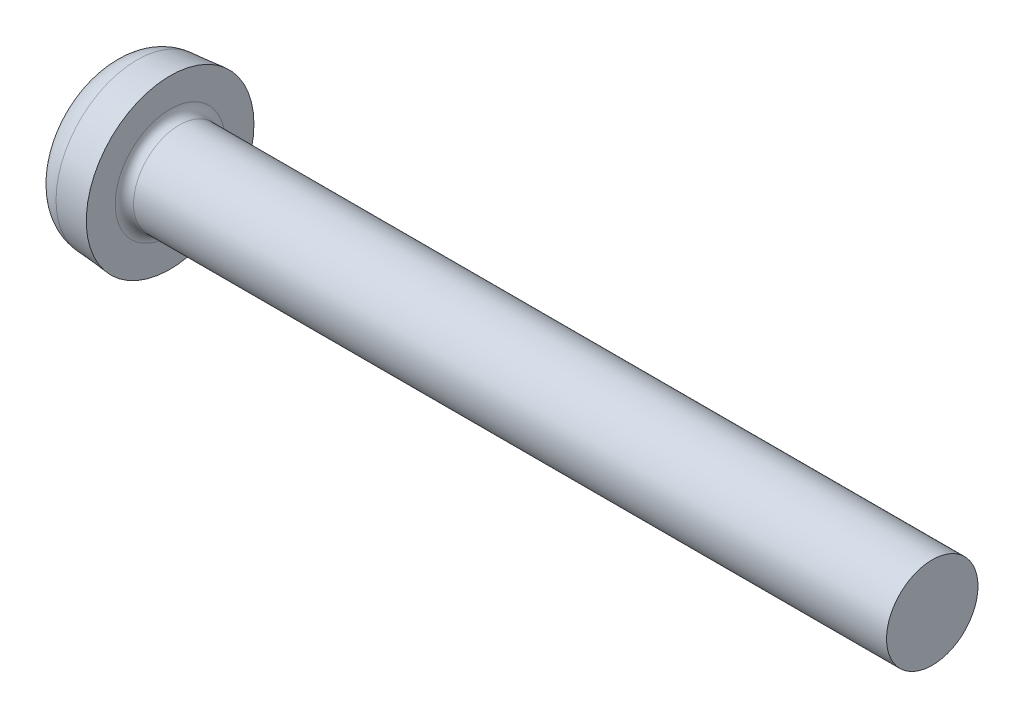
ISO-10303-21;
HEADER;
FILE_DESCRIPTION(('STEP AP214'),'2;1');
FILE_NAME('part.step','',(''),(''),'','','');
FILE_SCHEMA(('AUTOMOTIVE_DESIGN { 1 0 10303 214 1 1 1 1 }'));
ENDSEC;
DATA;
#1=APPLICATION_CONTEXT('core data for automotive mechanical design processes');
#2=APPLICATION_PROTOCOL_DEFINITION('international standard','automotive_design',2000,#1);
#3=PRODUCT_CONTEXT('',#1,'mechanical');
#4=PRODUCT('Part','Part','',(#3));
#5=PRODUCT_RELATED_PRODUCT_CATEGORY('part','',(#4));
#6=PRODUCT_DEFINITION_FORMATION('','',#4);
#7=PRODUCT_DEFINITION_CONTEXT('part definition',#1,'design');
#8=PRODUCT_DEFINITION('design','',#6,#7);
#9=PRODUCT_DEFINITION_SHAPE('','',#8);
#10=(LENGTH_UNIT() NAMED_UNIT(*) SI_UNIT(.MILLI.,.METRE.));
#11=(NAMED_UNIT(*) PLANE_ANGLE_UNIT() SI_UNIT($,.RADIAN.));
#12=(NAMED_UNIT(*) SI_UNIT($,.STERADIAN.) SOLID_ANGLE_UNIT());
#13=UNCERTAINTY_MEASURE_WITH_UNIT(LENGTH_MEASURE(1.E-05),#10,'distance_accuracy_value','');
#14=(GEOMETRIC_REPRESENTATION_CONTEXT(3) GLOBAL_UNCERTAINTY_ASSIGNED_CONTEXT((#13)) GLOBAL_UNIT_ASSIGNED_CONTEXT((#10,
#11,#12)) REPRESENTATION_CONTEXT('',''));
#15=CARTESIAN_POINT('',(0.,0.,0.));
#16=DIRECTION('',(0.,0.,1.));
#17=DIRECTION('',(1.,0.,0.));
#18=AXIS2_PLACEMENT_3D('',#15,#16,#17);
#19=CARTESIAN_POINT('',(0.,0.,0.));
#20=DIRECTION('',(-1.,0.,0.));
#21=DIRECTION('',(0.,0.,1.));
#22=AXIS2_PLACEMENT_3D('',#19,#20,#21);
#23=PLANE('',#22);
#24=DIRECTION('',(0.,1.,0.));
#25=VECTOR('',#24,1.);
#26=CARTESIAN_POINT('',(0.,0.35,-0.35));
#27=LINE('',#26,#25);
#28=CARTESIAN_POINT('',(0.,0.65,-0.35));
#29=VERTEX_POINT('',#28);
#30=CARTESIAN_POINT('',(0.,1.62134434609834,-0.35));
#31=VERTEX_POINT('',#30);
#32=EDGE_CURVE('E344',#29,#31,#27,.T.);
#33=ORIENTED_EDGE('',*,*,#32,.T.);
#34=CARTESIAN_POINT('',(0.,0.,0.));
#35=DIRECTION('',(-1.,0.,0.));
#36=DIRECTION('',(0.,0.,1.));
#37=AXIS2_PLACEMENT_3D('',#34,#35,#36);
#38=CIRCLE('',#37,1.65869149893072);
#39=CARTESIAN_POINT('',(0.,0.35,-1.62134434609834));
#40=VERTEX_POINT('',#39);
#41=EDGE_CURVE('E309',#31,#40,#38,.T.);
#42=ORIENTED_EDGE('',*,*,#41,.T.);
#43=DIRECTION('',(0.,0.,1.));
#44=VECTOR('',#43,1.);
#45=CARTESIAN_POINT('',(0.,0.35,-0.35));
#46=LINE('',#45,#44);
#47=CARTESIAN_POINT('',(0.,0.35,-0.65));
#48=VERTEX_POINT('',#47);
#49=EDGE_CURVE('E322',#40,#48,#46,.T.);
#50=ORIENTED_EDGE('',*,*,#49,.T.);
#51=CARTESIAN_POINT('',(0.,0.65,-0.65));
#52=DIRECTION('',(-1.,0.,0.));
#53=DIRECTION('',(0.,0.,1.));
#54=AXIS2_PLACEMENT_3D('',#51,#52,#53);
#55=CIRCLE('',#54,0.3);
#56=EDGE_CURVE('E371',#48,#29,#55,.T.);
#57=ORIENTED_EDGE('',*,*,#56,.T.);
#58=EDGE_LOOP('',(#33,#42,#50,#57));
#59=FACE_BOUND('',#58,.T.);
#60=ADVANCED_FACE('F39',(#59),#23,.T.);
#61=DIRECTION('',(0.,0.,-1.));
#62=VECTOR('',#61,1.);
#63=CARTESIAN_POINT('',(0.,-0.35,-0.35));
#64=LINE('',#63,#62);
#65=CARTESIAN_POINT('',(0.,-0.35,-0.65));
#66=VERTEX_POINT('',#65);
#67=CARTESIAN_POINT('',(0.,-0.35,-1.62134434609834));
#68=VERTEX_POINT('',#67);
#69=EDGE_CURVE('E337',#66,#68,#64,.T.);
#70=ORIENTED_EDGE('',*,*,#69,.T.);
#71=CARTESIAN_POINT('',(0.,0.,0.));
#72=DIRECTION('',(-1.,0.,0.));
#73=DIRECTION('',(0.,0.,1.));
#74=AXIS2_PLACEMENT_3D('',#71,#72,#73);
#75=CIRCLE('',#74,1.65869149893072);
#76=CARTESIAN_POINT('',(0.,-1.62134434609834,-0.35));
#77=VERTEX_POINT('',#76);
#78=EDGE_CURVE('E301',#68,#77,#75,.T.);
#79=ORIENTED_EDGE('',*,*,#78,.T.);
#80=DIRECTION('',(0.,1.,0.));
#81=VECTOR('',#80,1.);
#82=CARTESIAN_POINT('',(0.,-0.35,-0.35));
#83=LINE('',#82,#81);
#84=CARTESIAN_POINT('',(0.,-0.65,-0.35));
#85=VERTEX_POINT('',#84);
#86=EDGE_CURVE('E114',#77,#85,#83,.T.);
#87=ORIENTED_EDGE('',*,*,#86,.T.);
#88=CARTESIAN_POINT('',(0.,-0.65,-0.65));
#89=DIRECTION('',(-1.,0.,0.));
#90=DIRECTION('',(0.,0.,1.));
#91=AXIS2_PLACEMENT_3D('',#88,#89,#90);
#92=CIRCLE('',#91,0.3);
#93=EDGE_CURVE('E342',#85,#66,#92,.T.);
#94=ORIENTED_EDGE('',*,*,#93,.T.);
#95=EDGE_LOOP('',(#70,#79,#87,#94));
#96=FACE_BOUND('',#95,.T.);
#97=ADVANCED_FACE('F252',(#96),#23,.T.);
#98=DIRECTION('',(0.,-1.,0.));
#99=VECTOR('',#98,1.);
#100=CARTESIAN_POINT('',(0.,-0.35,0.35));
#101=LINE('',#100,#99);
#102=CARTESIAN_POINT('',(0.,-0.65,0.35));
#103=VERTEX_POINT('',#102);
#104=CARTESIAN_POINT('',(0.,-1.62134434609834,0.349999999999999));
#105=VERTEX_POINT('',#104);
#106=EDGE_CURVE('E346',#103,#105,#101,.T.);
#107=ORIENTED_EDGE('',*,*,#106,.T.);
#108=CARTESIAN_POINT('',(0.,0.,0.));
#109=DIRECTION('',(-1.,0.,0.));
#110=DIRECTION('',(0.,0.,1.));
#111=AXIS2_PLACEMENT_3D('',#108,#109,#110);
#112=CIRCLE('',#111,1.65869149893072);
#113=CARTESIAN_POINT('',(0.,-0.35,1.62134434609834));
#114=VERTEX_POINT('',#113);
#115=EDGE_CURVE('E297',#105,#114,#112,.T.);
#116=ORIENTED_EDGE('',*,*,#115,.T.);
#117=DIRECTION('',(0.,0.,-1.));
#118=VECTOR('',#117,1.);
#119=CARTESIAN_POINT('',(0.,-0.35,0.35));
#120=LINE('',#119,#118);
#121=CARTESIAN_POINT('',(0.,-0.35,0.65));
#122=VERTEX_POINT('',#121);
#123=EDGE_CURVE('E292',#114,#122,#120,.T.);
#124=ORIENTED_EDGE('',*,*,#123,.T.);
#125=CARTESIAN_POINT('',(0.,-0.65,0.65));
#126=DIRECTION('',(-1.,0.,0.));
#127=DIRECTION('',(0.,0.,1.));
#128=AXIS2_PLACEMENT_3D('',#125,#126,#127);
#129=CIRCLE('',#128,0.3);
#130=EDGE_CURVE('E376',#122,#103,#129,.T.);
#131=ORIENTED_EDGE('',*,*,#130,.T.);
#132=EDGE_LOOP('',(#107,#116,#124,#131));
#133=FACE_BOUND('',#132,.T.);
#134=ADVANCED_FACE('F259',(#133),#23,.T.);
#135=DIRECTION('',(0.,0.,1.));
#136=VECTOR('',#135,1.);
#137=CARTESIAN_POINT('',(0.,0.35,0.35));
#138=LINE('',#137,#136);
#139=CARTESIAN_POINT('',(0.,0.35,0.65));
#140=VERTEX_POINT('',#139);
#141=CARTESIAN_POINT('',(0.,0.35,1.62134434609834));
#142=VERTEX_POINT('',#141);
#143=EDGE_CURVE('E278',#140,#142,#138,.T.);
#144=ORIENTED_EDGE('',*,*,#143,.T.);
#145=CARTESIAN_POINT('',(0.,0.,0.));
#146=DIRECTION('',(-1.,0.,0.));
#147=DIRECTION('',(0.,0.,1.));
#148=AXIS2_PLACEMENT_3D('',#145,#146,#147);
#149=CIRCLE('',#148,1.65869149893072);
#150=CARTESIAN_POINT('',(0.,1.62134434609834,0.35));
#151=VERTEX_POINT('',#150);
#152=EDGE_CURVE('E282',#142,#151,#149,.T.);
#153=ORIENTED_EDGE('',*,*,#152,.T.);
#154=DIRECTION('',(0.,-1.,0.));
#155=VECTOR('',#154,1.);
#156=CARTESIAN_POINT('',(0.,0.35,0.35));
#157=LINE('',#156,#155);
#158=CARTESIAN_POINT('',(0.,0.65,0.35));
#159=VERTEX_POINT('',#158);
#160=EDGE_CURVE('E351',#151,#159,#157,.T.);
#161=ORIENTED_EDGE('',*,*,#160,.T.);
#162=CARTESIAN_POINT('',(0.,0.65,0.65));
#163=DIRECTION('',(-1.,0.,0.));
#164=DIRECTION('',(0.,0.,1.));
#165=AXIS2_PLACEMENT_3D('',#162,#163,#164);
#166=CIRCLE('',#165,0.3);
#167=EDGE_CURVE('E286',#159,#140,#166,.T.);
#168=ORIENTED_EDGE('',*,*,#167,.T.);
#169=EDGE_LOOP('',(#144,#153,#161,#168));
#170=FACE_BOUND('',#169,.T.);
#171=ADVANCED_FACE('F255',(#170),#23,.T.);
#172=CARTESIAN_POINT('',(27.,1.5,0.));
#173=DIRECTION('',(1.,0.,0.));
#174=DIRECTION('',(0.,0.,-1.));
#175=AXIS2_PLACEMENT_3D('',#172,#173,#174);
#176=PLANE('',#175);
#177=CARTESIAN_POINT('',(27.,0.,0.));
#178=DIRECTION('',(1.,0.,0.));
#179=DIRECTION('',(0.,0.,-1.));
#180=AXIS2_PLACEMENT_3D('',#177,#178,#179);
#181=CIRCLE('',#180,1.5);
#182=CARTESIAN_POINT('',(27.,0.,-1.5));
#183=VERTEX_POINT('',#182);
#184=EDGE_CURVE('E365',#183,#183,#181,.T.);
#185=ORIENTED_EDGE('',*,*,#184,.T.);
#186=EDGE_LOOP('',(#185));
#187=FACE_BOUND('',#186,.T.);
#188=ADVANCED_FACE('F264',(#187),#176,.T.);
#189=CARTESIAN_POINT('',(4.51581291088132,0.,0.));
#190=DIRECTION('',(1.,0.,0.));
#191=DIRECTION('',(0.,0.,-1.));
#192=AXIS2_PLACEMENT_3D('',#189,#190,#191);
#193=CYLINDRICAL_SURFACE('',#192,1.5);
#194=CARTESIAN_POINT('',(2.3,0.,0.));
#195=DIRECTION('',(1.,0.,0.));
#196=DIRECTION('',(0.,0.,-1.));
#197=AXIS2_PLACEMENT_3D('',#194,#195,#196);
#198=CIRCLE('',#197,1.5);
#199=CARTESIAN_POINT('',(2.3,0.,-1.5));
#200=VERTEX_POINT('',#199);
#201=EDGE_CURVE('E362',#200,#200,#198,.T.);
#202=ORIENTED_EDGE('',*,*,#201,.T.);
#203=EDGE_LOOP('',(#202));
#204=FACE_BOUND('',#203,.T.);
#205=ORIENTED_EDGE('',*,*,#184,.F.);
#206=EDGE_LOOP('',(#205));
#207=FACE_BOUND('',#206,.T.);
#208=ADVANCED_FACE('F270',(#204,#207),#193,.T.);
#209=CARTESIAN_POINT('',(2.3,0.,0.));
#210=DIRECTION('',(1.,0.,0.));
#211=DIRECTION('',(0.,0.,-1.));
#212=AXIS2_PLACEMENT_3D('',#209,#210,#211);
#213=TOROIDAL_SURFACE('',#212,1.8,0.3);
#214=CARTESIAN_POINT('',(2.,0.,0.));
#215=DIRECTION('',(1.,0.,0.));
#216=DIRECTION('',(0.,0.,-1.));
#217=AXIS2_PLACEMENT_3D('',#214,#215,#216);
#218=CIRCLE('',#217,1.8);
#219=CARTESIAN_POINT('',(2.,0.,-1.8));
#220=VERTEX_POINT('',#219);
#221=EDGE_CURVE('E358',#220,#220,#218,.T.);
#222=ORIENTED_EDGE('',*,*,#221,.T.);
#223=EDGE_LOOP('',(#222));
#224=FACE_BOUND('',#223,.T.);
#225=ORIENTED_EDGE('',*,*,#201,.F.);
#226=EDGE_LOOP('',(#225));
#227=FACE_BOUND('',#226,.T.);
#228=ADVANCED_FACE('F530',(#224,#227),#213,.F.);
#229=CARTESIAN_POINT('',(2.,1.8,0.));
#230=DIRECTION('',(1.,0.,0.));
#231=DIRECTION('',(0.,0.,-1.));
#232=AXIS2_PLACEMENT_3D('',#229,#230,#231);
#233=PLANE('',#232);
#234=CARTESIAN_POINT('',(2.,0.,0.));
#235=DIRECTION('',(1.,0.,0.));
#236=DIRECTION('',(0.,0.,-1.));
#237=AXIS2_PLACEMENT_3D('',#234,#235,#236);
#238=CIRCLE('',#237,2.75);
#239=CARTESIAN_POINT('',(2.,0.,-2.75));
#240=VERTEX_POINT('',#239);
#241=EDGE_CURVE('E354',#240,#240,#238,.T.);
#242=ORIENTED_EDGE('',*,*,#241,.T.);
#243=EDGE_LOOP('',(#242));
#244=FACE_BOUND('',#243,.T.);
#245=ORIENTED_EDGE('',*,*,#221,.F.);
#246=EDGE_LOOP('',(#245));
#247=FACE_BOUND('',#246,.T.);
#248=ADVANCED_FACE('F534',(#244,#247),#233,.T.);
#249=CARTESIAN_POINT('',(2.,0.,0.));
#250=DIRECTION('',(1.,0.,0.));
#251=DIRECTION('',(0.,0.,-1.));
#252=AXIS2_PLACEMENT_3D('',#249,#250,#251);
#253=CONICAL_SURFACE('',#252,2.75,0.0872664625997202);
#254=CARTESIAN_POINT('',(0.91284425725234,0.,0.));
#255=DIRECTION('',(-1.,0.,0.));
#256=DIRECTION('',(0.,0.,1.));
#257=AXIS2_PLACEMENT_3D('',#254,#255,#256);
#258=CIRCLE('',#257,2.65488619702247);
#259=CARTESIAN_POINT('',(0.91284425725234,0.,2.65488619702247));
#260=VERTEX_POINT('',#259);
#261=EDGE_CURVE('E298',#260,#260,#258,.F.);
#262=ORIENTED_EDGE('',*,*,#261,.T.);
#263=EDGE_LOOP('',(#262));
#264=FACE_BOUND('',#263,.T.);
#265=ORIENTED_EDGE('',*,*,#241,.F.);
#266=EDGE_LOOP('',(#265));
#267=FACE_BOUND('',#266,.T.);
#268=ADVANCED_FACE('F537',(#264,#267),#253,.T.);
#269=CARTESIAN_POINT('',(2.,0.35,0.35));
#270=DIRECTION('',(0.,-1.,0.));
#271=DIRECTION('',(0.,0.,-1.));
#272=AXIS2_PLACEMENT_3D('',#269,#270,#271);
#273=PLANE('',#272);
#274=DIRECTION('',(-0.939692620785908,0.,0.342020143325669));
#275=VECTOR('',#274,1.);
#276=CARTESIAN_POINT('',(0.,0.35,1.75));
#277=LINE('',#276,#275);
#278=CARTESIAN_POINT('',(2.,0.35,1.02205953146759));
#279=VERTEX_POINT('',#278);
#280=CARTESIAN_POINT('',(0.00762366491673901,0.35,1.74722521289429));
#281=VERTEX_POINT('',#280);
#282=EDGE_CURVE('E359',#279,#281,#277,.T.);
#283=ORIENTED_EDGE('',*,*,#282,.T.);
#284=CARTESIAN_POINT('',(0.00796535573110795,0.35,1.75));
#285=CARTESIAN_POINT('',(0.00530925160597725,0.35,1.72863961284289));
#286=CARTESIAN_POINT('',(0.00331741989986699,0.35,1.70723809914295));
#287=CARTESIAN_POINT('',(0.000662305181537883,0.35,1.66435288093683));
#288=CARTESIAN_POINT('',(-9.81689388392556E-07,0.35,1.64286917666955));
#289=CARTESIAN_POINT('',(0.,0.35,1.62134434609834));
#290=B_SPLINE_CURVE_WITH_KNOTS('',3,(#284,#285,#286,#287,#288,#289),.UNSPECIFIED.,.F.,.F.,(4,2,
4),(0.,0.0644820102024402,0.128963833119088),.UNSPECIFIED.);
#291=EDGE_CURVE('E189',#281,#142,#290,.T.);
#292=ORIENTED_EDGE('',*,*,#291,.T.);
#293=ORIENTED_EDGE('',*,*,#143,.F.);
#294=DIRECTION('',(-1.,0.,0.));
#295=VECTOR('',#294,1.);
#296=CARTESIAN_POINT('',(2.,0.35,0.65));
#297=LINE('',#296,#295);
#298=CARTESIAN_POINT('',(2.,0.35,0.65));
#299=VERTEX_POINT('',#298);
#300=EDGE_CURVE('E389',#140,#299,#297,.F.);
#301=ORIENTED_EDGE('',*,*,#300,.T.);
#302=DIRECTION('',(0.,0.,1.));
#303=VECTOR('',#302,1.);
#304=CARTESIAN_POINT('',(2.,0.35,0.35));
#305=LINE('',#304,#303);
#306=EDGE_CURVE('E353',#299,#279,#305,.T.);
#307=ORIENTED_EDGE('',*,*,#306,.T.);
#308=EDGE_LOOP('',(#283,#292,#293,#301,#307));
#309=FACE_BOUND('',#308,.T.);
#310=ADVANCED_FACE('F444',(#309),#273,.T.);
#311=CARTESIAN_POINT('',(0.,0.,1.75));
#312=DIRECTION('',(-0.342020143325669,0.,-0.939692620785908));
#313=DIRECTION('',(-0.939692620785908,0.,0.342020143325669));
#314=AXIS2_PLACEMENT_3D('',#311,#312,#313);
#315=PLANE('',#314);
#316=DIRECTION('',(-0.939692620785908,0.,0.342020143325669));
#317=VECTOR('',#316,1.);
#318=CARTESIAN_POINT('',(2.21599576989956,-0.35,0.943443500496743));
#319=LINE('',#318,#317);
#320=CARTESIAN_POINT('',(2.,-0.35,1.02205953146759));
#321=VERTEX_POINT('',#320);
#322=CARTESIAN_POINT('',(0.00762366491673973,-0.35,1.74722521289429));
#323=VERTEX_POINT('',#322);
#324=EDGE_CURVE('E440',#321,#323,#319,.T.);
#325=ORIENTED_EDGE('',*,*,#324,.T.);
#326=CARTESIAN_POINT('',(0.00762366491673973,-0.35,1.74722521289429));
#327=CARTESIAN_POINT('',(0.00630099140167022,-0.291673398723648,1.74770662668342));
#328=CARTESIAN_POINT('',(0.00540592205497321,-0.233339136124059,1.74803240528323));
#329=CARTESIAN_POINT('',(0.00427721541103727,-0.11666991507326,1.74844322090484));
#330=CARTESIAN_POINT('',(0.00404349915785195,-0.0583349575366301,1.74852828666426));
#331=CARTESIAN_POINT('',(0.00404349915785195,0.0583349575366294,1.74852828666426));
#332=CARTESIAN_POINT('',(0.00427721541103727,0.116669915073259,1.74844322090484));
#333=CARTESIAN_POINT('',(0.00540592205497322,0.233339136124058,1.74803240528323));
#334=CARTESIAN_POINT('',(0.00630099140167022,0.291673398723647,1.74770662668342));
#335=CARTESIAN_POINT('',(0.00762366491673974,0.35,1.74722521289429));
#336=B_SPLINE_CURVE_WITH_KNOTS('',3,(#326,#327,#328,#329,#330,#331,#332,#333,#334,#335),
.UNSPECIFIED.,.F.,.F.,(4,2,2,2,4),(0.,0.17502399992484,0.350027103646371,0.525030207367903,
0.700054207292742),.UNSPECIFIED.);
#337=EDGE_CURVE('E137',#323,#281,#336,.T.);
#338=ORIENTED_EDGE('',*,*,#337,.T.);
#339=ORIENTED_EDGE('',*,*,#282,.F.);
#340=DIRECTION('',(0.,-1.,0.));
#341=VECTOR('',#340,1.);
#342=CARTESIAN_POINT('',(2.,0.,1.02205953146759));
#343=LINE('',#342,#341);
#344=EDGE_CURVE('E447',#279,#321,#343,.T.);
#345=ORIENTED_EDGE('',*,*,#344,.T.);
#346=EDGE_LOOP('',(#325,#338,#339,#345));
#347=FACE_BOUND('',#346,.T.);
#348=ADVANCED_FACE('F167',(#347),#315,.T.);
#349=CARTESIAN_POINT('',(2.,-0.35,0.35));
#350=DIRECTION('',(0.,1.,0.));
#351=DIRECTION('',(0.,0.,1.));
#352=AXIS2_PLACEMENT_3D('',#349,#350,#351);
#353=PLANE('',#352);
#354=ORIENTED_EDGE('',*,*,#123,.F.);
#355=CARTESIAN_POINT('',(0.,-0.35,1.62134434609834));
#356=CARTESIAN_POINT('',(-9.81689387233393E-07,-0.35,1.64286917666955));
#357=CARTESIAN_POINT('',(0.000662305181538479,-0.35,1.66435288093683));
#358=CARTESIAN_POINT('',(0.00331741989986632,-0.35,1.70723809914295));
#359=CARTESIAN_POINT('',(0.00530925160597587,-0.35,1.72863961284289));
#360=CARTESIAN_POINT('',(0.00796535573110579,-0.35,1.75));
#361=B_SPLINE_CURVE_WITH_KNOTS('',3,(#355,#356,#357,#358,#359,#360),.UNSPECIFIED.,.F.,.F.,(4,2,
4),(0.,0.0644818229166476,0.128963833119088),.UNSPECIFIED.);
#362=EDGE_CURVE('E131',#114,#323,#361,.T.);
#363=ORIENTED_EDGE('',*,*,#362,.T.);
#364=ORIENTED_EDGE('',*,*,#324,.F.);
#365=DIRECTION('',(0.,0.,-1.));
#366=VECTOR('',#365,1.);
#367=CARTESIAN_POINT('',(2.,-0.35,0.35));
#368=LINE('',#367,#366);
#369=CARTESIAN_POINT('',(2.,-0.35,0.65));
#370=VERTEX_POINT('',#369);
#371=EDGE_CURVE('E448',#321,#370,#368,.T.);
#372=ORIENTED_EDGE('',*,*,#371,.T.);
#373=DIRECTION('',(-1.,0.,0.));
#374=VECTOR('',#373,1.);
#375=CARTESIAN_POINT('',(2.,-0.35,0.65));
#376=LINE('',#375,#374);
#377=EDGE_CURVE('E368',#370,#122,#376,.T.);
#378=ORIENTED_EDGE('',*,*,#377,.T.);
#379=EDGE_LOOP('',(#354,#363,#364,#372,#378));
#380=FACE_BOUND('',#379,.T.);
#381=ADVANCED_FACE('F474',(#380),#353,.T.);
#382=CARTESIAN_POINT('',(2.,-0.35,0.35));
#383=DIRECTION('',(0.,0.,-1.));
#384=DIRECTION('',(0.,1.,0.));
#385=AXIS2_PLACEMENT_3D('',#382,#383,#384);
#386=PLANE('',#385);
#387=DIRECTION('',(-0.939692620785908,-0.342020143325669,0.));
#388=VECTOR('',#387,1.);
#389=CARTESIAN_POINT('',(0.,-1.75,0.349999999999999));
#390=LINE('',#389,#388);
#391=CARTESIAN_POINT('',(2.,-1.02205953146759,0.349999999999999));
#392=VERTEX_POINT('',#391);
#393=CARTESIAN_POINT('',(0.00762366491673901,-1.74722521289429,0.349999999999999));
#394=VERTEX_POINT('',#393);
#395=EDGE_CURVE('E121',#392,#394,#390,.T.);
#396=ORIENTED_EDGE('',*,*,#395,.T.);
#397=CARTESIAN_POINT('',(0.00796535573110795,-1.75,0.349999999999999));
#398=CARTESIAN_POINT('',(0.00530925160597725,-1.72863961284289,0.349999999999999));
#399=CARTESIAN_POINT('',(0.003317419899867,-1.70723809914295,0.349999999999999));
#400=CARTESIAN_POINT('',(0.000662305181537898,-1.66435288093683,0.349999999999999));
#401=CARTESIAN_POINT('',(-9.81689388374026E-07,-1.64286917666955,0.349999999999999));
#402=CARTESIAN_POINT('',(0.,-1.62134434609834,0.349999999999999));
#403=B_SPLINE_CURVE_WITH_KNOTS('',3,(#397,#398,#399,#400,#401,#402),.UNSPECIFIED.,.F.,.F.,(4,2,
4),(0.,0.06448201020244,0.128963833119087),.UNSPECIFIED.);
#404=EDGE_CURVE('E130',#394,#105,#403,.T.);
#405=ORIENTED_EDGE('',*,*,#404,.T.);
#406=ORIENTED_EDGE('',*,*,#106,.F.);
#407=DIRECTION('',(-1.,0.,0.));
#408=VECTOR('',#407,1.);
#409=CARTESIAN_POINT('',(2.,-0.65,0.35));
#410=LINE('',#409,#408);
#411=CARTESIAN_POINT('',(2.,-0.65,0.35));
#412=VERTEX_POINT('',#411);
#413=EDGE_CURVE('E379',#103,#412,#410,.F.);
#414=ORIENTED_EDGE('',*,*,#413,.T.);
#415=DIRECTION('',(0.,-1.,0.));
#416=VECTOR('',#415,1.);
#417=CARTESIAN_POINT('',(2.,-0.35,0.35));
#418=LINE('',#417,#416);
#419=EDGE_CURVE('E450',#412,#392,#418,.T.);
#420=ORIENTED_EDGE('',*,*,#419,.T.);
#421=EDGE_LOOP('',(#396,#405,#406,#414,#420));
#422=FACE_BOUND('',#421,.T.);
#423=ADVANCED_FACE('F158',(#422),#386,.T.);
#424=CARTESIAN_POINT('',(0.,-1.75,0.));
#425=DIRECTION('',(-0.342020143325669,0.939692620785908,0.));
#426=DIRECTION('',(-0.939692620785908,-0.342020143325669,0.));
#427=AXIS2_PLACEMENT_3D('',#424,#425,#426);
#428=PLANE('',#427);
#429=DIRECTION('',(-0.939692620785908,-0.342020143325669,0.));
#430=VECTOR('',#429,1.);
#431=CARTESIAN_POINT('',(2.21599576989956,-0.943443500496743,-0.35));
#432=LINE('',#431,#430);
#433=CARTESIAN_POINT('',(2.,-1.02205953146759,-0.35));
#434=VERTEX_POINT('',#433);
#435=CARTESIAN_POINT('',(0.00762366491673973,-1.74722521289429,-0.35));
#436=VERTEX_POINT('',#435);
#437=EDGE_CURVE('E109',#434,#436,#432,.T.);
#438=ORIENTED_EDGE('',*,*,#437,.T.);
#439=CARTESIAN_POINT('',(0.00762366491673973,-1.74722521289429,-0.35));
#440=CARTESIAN_POINT('',(0.00630099140167022,-1.74770662668342,-0.291673398723648));
#441=CARTESIAN_POINT('',(0.00540592205497322,-1.74803240528323,-0.233339136124059));
#442=CARTESIAN_POINT('',(0.00427721541103729,-1.74844322090484,-0.11666991507326));
#443=CARTESIAN_POINT('',(0.00404349915785197,-1.74852828666426,-0.05833495753663));
#444=CARTESIAN_POINT('',(0.00404349915785198,-1.74852828666426,0.0583349575366293));
#445=CARTESIAN_POINT('',(0.0042772154110373,-1.74844322090484,0.116669915073259));
#446=CARTESIAN_POINT('',(0.00540592205497326,-1.74803240528323,0.233339136124058));
#447=CARTESIAN_POINT('',(0.00630099140167027,-1.74770662668342,0.291673398723647));
#448=CARTESIAN_POINT('',(0.00762366491673978,-1.74722521289429,0.349999999999999));
#449=B_SPLINE_CURVE_WITH_KNOTS('',3,(#439,#440,#441,#442,#443,#444,#445,#446,#447,#448),
.UNSPECIFIED.,.F.,.F.,(4,2,2,2,4),(0.,0.17502399992484,0.350027103646371,0.525030207367903,
0.700054207292742),.UNSPECIFIED.);
#450=EDGE_CURVE('E44',#436,#394,#449,.T.);
#451=ORIENTED_EDGE('',*,*,#450,.T.);
#452=ORIENTED_EDGE('',*,*,#395,.F.);
#453=DIRECTION('',(0.,0.,-1.));
#454=VECTOR('',#453,1.);
#455=CARTESIAN_POINT('',(2.,-1.02205953146759,0.));
#456=LINE('',#455,#454);
#457=EDGE_CURVE('E120',#392,#434,#456,.T.);
#458=ORIENTED_EDGE('',*,*,#457,.T.);
#459=EDGE_LOOP('',(#438,#451,#452,#458));
#460=FACE_BOUND('',#459,.T.);
#461=ADVANCED_FACE('F41',(#460),#428,.T.);
#462=CARTESIAN_POINT('',(2.,-0.35,-0.35));
#463=DIRECTION('',(0.,0.,1.));
#464=DIRECTION('',(1.,0.,0.));
#465=AXIS2_PLACEMENT_3D('',#462,#463,#464);
#466=PLANE('',#465);
#467=ORIENTED_EDGE('',*,*,#86,.F.);
#468=CARTESIAN_POINT('',(0.,-1.62134434609834,-0.35));
#469=CARTESIAN_POINT('',(-9.81689387233244E-07,-1.64286917666955,-0.35));
#470=CARTESIAN_POINT('',(0.000662305181538479,-1.66435288093683,-0.35));
#471=CARTESIAN_POINT('',(0.00331741989986632,-1.70723809914295,-0.35));
#472=CARTESIAN_POINT('',(0.00530925160597587,-1.72863961284289,-0.35));
#473=CARTESIAN_POINT('',(0.00796535573110579,-1.75,-0.35));
#474=B_SPLINE_CURVE_WITH_KNOTS('',3,(#468,#469,#470,#471,#472,#473),.UNSPECIFIED.,.F.,.F.,(4,2,
4),(0.,0.0644818229166476,0.128963833119088),.UNSPECIFIED.);
#475=EDGE_CURVE('E106',#77,#436,#474,.T.);
#476=ORIENTED_EDGE('',*,*,#475,.T.);
#477=ORIENTED_EDGE('',*,*,#437,.F.);
#478=DIRECTION('',(0.,1.,0.));
#479=VECTOR('',#478,1.);
#480=CARTESIAN_POINT('',(2.,-0.35,-0.35));
#481=LINE('',#480,#479);
#482=CARTESIAN_POINT('',(2.,-0.65,-0.35));
#483=VERTEX_POINT('',#482);
#484=EDGE_CURVE('E455',#434,#483,#481,.T.);
#485=ORIENTED_EDGE('',*,*,#484,.T.);
#486=DIRECTION('',(-1.,0.,0.));
#487=VECTOR('',#486,1.);
#488=CARTESIAN_POINT('',(2.,-0.65,-0.35));
#489=LINE('',#488,#487);
#490=EDGE_CURVE('E382',#483,#85,#489,.T.);
#491=ORIENTED_EDGE('',*,*,#490,.T.);
#492=EDGE_LOOP('',(#467,#476,#477,#485,#491));
#493=FACE_BOUND('',#492,.T.);
#494=ADVANCED_FACE('F107',(#493),#466,.T.);
#495=CARTESIAN_POINT('',(2.,-0.35,-0.35));
#496=DIRECTION('',(0.,1.,0.));
#497=DIRECTION('',(0.,0.,1.));
#498=AXIS2_PLACEMENT_3D('',#495,#496,#497);
#499=PLANE('',#498);
#500=DIRECTION('',(-0.939692620785908,0.,-0.342020143325669));
#501=VECTOR('',#500,1.);
#502=CARTESIAN_POINT('',(0.,-0.35,-1.75));
#503=LINE('',#502,#501);
#504=CARTESIAN_POINT('',(2.,-0.35,-1.02205953146759));
#505=VERTEX_POINT('',#504);
#506=CARTESIAN_POINT('',(0.0076236649167392,-0.35,-1.74722521289429));
#507=VERTEX_POINT('',#506);
#508=EDGE_CURVE('E122',#505,#507,#503,.T.);
#509=ORIENTED_EDGE('',*,*,#508,.T.);
#510=CARTESIAN_POINT('',(0.00796535573110795,-0.35,-1.75));
#511=CARTESIAN_POINT('',(0.00530925160597727,-0.35,-1.72863961284289));
#512=CARTESIAN_POINT('',(0.00331741989986703,-0.35,-1.70723809914295));
#513=CARTESIAN_POINT('',(0.000662305181537945,-0.35,-1.66435288093683));
#514=CARTESIAN_POINT('',(-9.81689388313481E-07,-0.35,-1.64286917666955));
#515=CARTESIAN_POINT('',(0.,-0.35,-1.62134434609834));
#516=B_SPLINE_CURVE_WITH_KNOTS('',3,(#510,#511,#512,#513,#514,#515),.UNSPECIFIED.,.F.,.F.,(4,2,
4),(0.,0.0644820102024402,0.128963833119088),.UNSPECIFIED.);
#517=EDGE_CURVE('E117',#507,#68,#516,.T.);
#518=ORIENTED_EDGE('',*,*,#517,.T.);
#519=ORIENTED_EDGE('',*,*,#69,.F.);
#520=DIRECTION('',(-1.,0.,0.));
#521=VECTOR('',#520,1.);
#522=CARTESIAN_POINT('',(2.,-0.35,-0.65));
#523=LINE('',#522,#521);
#524=CARTESIAN_POINT('',(2.,-0.35,-0.65));
#525=VERTEX_POINT('',#524);
#526=EDGE_CURVE('E384',#66,#525,#523,.F.);
#527=ORIENTED_EDGE('',*,*,#526,.T.);
#528=DIRECTION('',(0.,0.,-1.));
#529=VECTOR('',#528,1.);
#530=CARTESIAN_POINT('',(2.,-0.35,-0.35));
#531=LINE('',#530,#529);
#532=EDGE_CURVE('E457',#525,#505,#531,.T.);
#533=ORIENTED_EDGE('',*,*,#532,.T.);
#534=EDGE_LOOP('',(#509,#518,#519,#527,#533));
#535=FACE_BOUND('',#534,.T.);
#536=ADVANCED_FACE('F237',(#535),#499,.T.);
#537=CARTESIAN_POINT('',(0.,0.,-1.75));
#538=DIRECTION('',(-0.342020143325669,0.,0.939692620785908));
#539=DIRECTION('',(0.939692620785908,0.,0.342020143325669));
#540=AXIS2_PLACEMENT_3D('',#537,#538,#539);
#541=PLANE('',#540);
#542=DIRECTION('',(-0.939692620785908,0.,-0.342020143325669));
#543=VECTOR('',#542,1.);
#544=CARTESIAN_POINT('',(2.21599576989956,0.35,-0.943443500496744));
#545=LINE('',#544,#543);
#546=CARTESIAN_POINT('',(2.,0.35,-1.02205953146759));
#547=VERTEX_POINT('',#546);
#548=CARTESIAN_POINT('',(0.00762366491673973,0.35,-1.74722521289429));
#549=VERTEX_POINT('',#548);
#550=EDGE_CURVE('E319',#547,#549,#545,.T.);
#551=ORIENTED_EDGE('',*,*,#550,.T.);
#552=CARTESIAN_POINT('',(0.00762366491673973,0.35,-1.74722521289429));
#553=CARTESIAN_POINT('',(0.00630099140167022,0.291673398723648,-1.74770662668343));
#554=CARTESIAN_POINT('',(0.00540592205497321,0.233339136124058,-1.74803240528323));
#555=CARTESIAN_POINT('',(0.00427721541103727,0.116669915073259,-1.74844322090484));
#556=CARTESIAN_POINT('',(0.00404349915785195,0.0583349575366297,-1.74852828666426));
#557=CARTESIAN_POINT('',(0.00404349915785195,-0.0583349575366298,-1.74852828666426));
#558=CARTESIAN_POINT('',(0.00427721541103728,-0.11666991507326,-1.74844322090484));
#559=CARTESIAN_POINT('',(0.00540592205497322,-0.233339136124058,-1.74803240528323));
#560=CARTESIAN_POINT('',(0.00630099140167022,-0.291673398723648,-1.74770662668343));
#561=CARTESIAN_POINT('',(0.00762366491673974,-0.35,-1.74722521289429));
#562=B_SPLINE_CURVE_WITH_KNOTS('',3,(#552,#553,#554,#555,#556,#557,#558,#559,#560,#561),
.UNSPECIFIED.,.F.,.F.,(4,2,2,2,4),(0.,0.17502399992484,0.350027103646371,0.525030207367903,
0.700054207292742),.UNSPECIFIED.);
#563=EDGE_CURVE('E225',#549,#507,#562,.T.);
#564=ORIENTED_EDGE('',*,*,#563,.T.);
#565=ORIENTED_EDGE('',*,*,#508,.F.);
#566=DIRECTION('',(0.,1.,0.));
#567=VECTOR('',#566,1.);
#568=CARTESIAN_POINT('',(2.,0.,-1.02205953146759));
#569=LINE('',#568,#567);
#570=EDGE_CURVE('E327',#505,#547,#569,.T.);
#571=ORIENTED_EDGE('',*,*,#570,.T.);
#572=EDGE_LOOP('',(#551,#564,#565,#571));
#573=FACE_BOUND('',#572,.T.);
#574=ADVANCED_FACE('F233',(#573),#541,.T.);
#575=CARTESIAN_POINT('',(2.,0.35,-0.35));
#576=DIRECTION('',(0.,-1.,0.));
#577=DIRECTION('',(0.,0.,-1.));
#578=AXIS2_PLACEMENT_3D('',#575,#576,#577);
#579=PLANE('',#578);
#580=ORIENTED_EDGE('',*,*,#49,.F.);
#581=CARTESIAN_POINT('',(0.,0.35,-1.62134434609834));
#582=CARTESIAN_POINT('',(-9.81689387196185E-07,0.35,-1.64286917666955));
#583=CARTESIAN_POINT('',(0.000662305181538552,0.35,-1.66435288093683));
#584=CARTESIAN_POINT('',(0.00331741989986647,0.35,-1.70723809914295));
#585=CARTESIAN_POINT('',(0.00530925160597605,0.35,-1.72863961284289));
#586=CARTESIAN_POINT('',(0.00796535573110601,0.35,-1.75));
#587=B_SPLINE_CURVE_WITH_KNOTS('',3,(#581,#582,#583,#584,#585,#586),.UNSPECIFIED.,.F.,.F.,(4,2,
4),(0.,0.0644818229166478,0.128963833119088),.UNSPECIFIED.);
#588=EDGE_CURVE('E145',#40,#549,#587,.T.);
#589=ORIENTED_EDGE('',*,*,#588,.T.);
#590=ORIENTED_EDGE('',*,*,#550,.F.);
#591=DIRECTION('',(0.,0.,1.));
#592=VECTOR('',#591,1.);
#593=CARTESIAN_POINT('',(2.,0.35,-0.35));
#594=LINE('',#593,#592);
#595=CARTESIAN_POINT('',(2.,0.35,-0.65));
#596=VERTEX_POINT('',#595);
#597=EDGE_CURVE('E410',#547,#596,#594,.T.);
#598=ORIENTED_EDGE('',*,*,#597,.T.);
#599=DIRECTION('',(-1.,0.,0.));
#600=VECTOR('',#599,1.);
#601=CARTESIAN_POINT('',(2.,0.35,-0.65));
#602=LINE('',#601,#600);
#603=EDGE_CURVE('E391',#596,#48,#602,.T.);
#604=ORIENTED_EDGE('',*,*,#603,.T.);
#605=EDGE_LOOP('',(#580,#589,#590,#598,#604));
#606=FACE_BOUND('',#605,.T.);
#607=ADVANCED_FACE('F236',(#606),#579,.T.);
#608=CARTESIAN_POINT('',(2.,0.35,-0.35));
#609=DIRECTION('',(0.,0.,1.));
#610=DIRECTION('',(1.,0.,0.));
#611=AXIS2_PLACEMENT_3D('',#608,#609,#610);
#612=PLANE('',#611);
#613=DIRECTION('',(-0.939692620785908,0.342020143325669,0.));
#614=VECTOR('',#613,1.);
#615=CARTESIAN_POINT('',(0.,1.75,-0.35));
#616=LINE('',#615,#614);
#617=CARTESIAN_POINT('',(2.,1.02205953146759,-0.35));
#618=VERTEX_POINT('',#617);
#619=CARTESIAN_POINT('',(0.00762366491673901,1.74722521289429,-0.35));
#620=VERTEX_POINT('',#619);
#621=EDGE_CURVE('E328',#618,#620,#616,.T.);
#622=ORIENTED_EDGE('',*,*,#621,.T.);
#623=CARTESIAN_POINT('',(0.00796535573110795,1.75,-0.35));
#624=CARTESIAN_POINT('',(0.00530925160597725,1.72863961284289,-0.35));
#625=CARTESIAN_POINT('',(0.00331741989986698,1.70723809914295,-0.35));
#626=CARTESIAN_POINT('',(0.000662305181537863,1.66435288093683,-0.35));
#627=CARTESIAN_POINT('',(-9.81689388417754E-07,1.64286917666955,-0.35));
#628=CARTESIAN_POINT('',(0.,1.62134434609834,-0.35));
#629=B_SPLINE_CURVE_WITH_KNOTS('',3,(#623,#624,#625,#626,#627,#628),.UNSPECIFIED.,.F.,.F.,(4,2,
4),(0.,0.0644820102024402,0.128963833119088),.UNSPECIFIED.);
#630=EDGE_CURVE('E11',#620,#31,#629,.T.);
#631=ORIENTED_EDGE('',*,*,#630,.T.);
#632=ORIENTED_EDGE('',*,*,#32,.F.);
#633=DIRECTION('',(-1.,0.,0.));
#634=VECTOR('',#633,1.);
#635=CARTESIAN_POINT('',(2.,0.65,-0.35));
#636=LINE('',#635,#634);
#637=CARTESIAN_POINT('',(2.,0.65,-0.35));
#638=VERTEX_POINT('',#637);
#639=EDGE_CURVE('E393',#29,#638,#636,.F.);
#640=ORIENTED_EDGE('',*,*,#639,.T.);
#641=DIRECTION('',(0.,1.,0.));
#642=VECTOR('',#641,1.);
#643=CARTESIAN_POINT('',(2.,0.35,-0.35));
#644=LINE('',#643,#642);
#645=EDGE_CURVE('E414',#638,#618,#644,.T.);
#646=ORIENTED_EDGE('',*,*,#645,.T.);
#647=EDGE_LOOP('',(#622,#631,#632,#640,#646));
#648=FACE_BOUND('',#647,.T.);
#649=ADVANCED_FACE('F243',(#648),#612,.T.);
#650=CARTESIAN_POINT('',(0.,1.75,0.));
#651=DIRECTION('',(-0.342020143325669,-0.939692620785908,0.));
#652=DIRECTION('',(0.939692620785908,-0.342020143325669,0.));
#653=AXIS2_PLACEMENT_3D('',#650,#651,#652);
#654=PLANE('',#653);
#655=DIRECTION('',(-0.939692620785908,0.342020143325669,0.));
#656=VECTOR('',#655,1.);
#657=CARTESIAN_POINT('',(2.21599576989956,0.943443500496743,0.35));
#658=LINE('',#657,#656);
#659=CARTESIAN_POINT('',(2.,1.02205953146759,0.35));
#660=VERTEX_POINT('',#659);
#661=CARTESIAN_POINT('',(0.00762366491673969,1.74722521289429,0.35));
#662=VERTEX_POINT('',#661);
#663=EDGE_CURVE('E463',#660,#662,#658,.T.);
#664=ORIENTED_EDGE('',*,*,#663,.T.);
#665=CARTESIAN_POINT('',(0.00762366491673969,1.74722521289429,0.35));
#666=CARTESIAN_POINT('',(0.00630099140167042,1.74770662668342,0.291673398723648));
#667=CARTESIAN_POINT('',(0.00540592205497344,1.74803240528323,0.233339136124059));
#668=CARTESIAN_POINT('',(0.00427721541103741,1.74844322090484,0.116669915073259));
#669=CARTESIAN_POINT('',(0.00404349915785197,1.74852828666426,0.0583349575366296));
#670=CARTESIAN_POINT('',(0.00404349915785189,1.74852828666426,-0.0583349575366298));
#671=CARTESIAN_POINT('',(0.00427721541103724,1.74844322090484,-0.11666991507326));
#672=CARTESIAN_POINT('',(0.00540592205497323,1.74803240528323,-0.233339136124059));
#673=CARTESIAN_POINT('',(0.00630099140167026,1.74770662668342,-0.291673398723648));
#674=CARTESIAN_POINT('',(0.00762366491673973,1.74722521289429,-0.35));
#675=B_SPLINE_CURVE_WITH_KNOTS('',3,(#665,#666,#667,#668,#669,#670,#671,#672,#673,#674),
.UNSPECIFIED.,.F.,.F.,(4,2,2,2,4),(0.,0.17502399992484,0.350027103646371,0.525030207367903,
0.700054207292743),.UNSPECIFIED.);
#676=EDGE_CURVE('E55',#662,#620,#675,.T.);
#677=ORIENTED_EDGE('',*,*,#676,.T.);
#678=ORIENTED_EDGE('',*,*,#621,.F.);
#679=DIRECTION('',(0.,0.,1.));
#680=VECTOR('',#679,1.);
#681=CARTESIAN_POINT('',(2.,1.02205953146759,0.));
#682=LINE('',#681,#680);
#683=EDGE_CURVE('E460',#618,#660,#682,.T.);
#684=ORIENTED_EDGE('',*,*,#683,.T.);
#685=EDGE_LOOP('',(#664,#677,#678,#684));
#686=FACE_BOUND('',#685,.T.);
#687=ADVANCED_FACE('F239',(#686),#654,.T.);
#688=CARTESIAN_POINT('',(2.,0.35,0.35));
#689=DIRECTION('',(0.,0.,-1.));
#690=DIRECTION('',(0.,1.,0.));
#691=AXIS2_PLACEMENT_3D('',#688,#689,#690);
#692=PLANE('',#691);
#693=ORIENTED_EDGE('',*,*,#160,.F.);
#694=CARTESIAN_POINT('',(0.,1.62134434609834,0.35));
#695=CARTESIAN_POINT('',(-9.81689387224292E-07,1.64286917666955,0.35));
#696=CARTESIAN_POINT('',(0.000662305181538492,1.66435288093683,0.35));
#697=CARTESIAN_POINT('',(0.00331741989986634,1.70723809914295,0.35));
#698=CARTESIAN_POINT('',(0.00530925160597589,1.72863961284289,0.35));
#699=CARTESIAN_POINT('',(0.00796535573110582,1.75,0.35));
#700=B_SPLINE_CURVE_WITH_KNOTS('',3,(#694,#695,#696,#697,#698,#699),.UNSPECIFIED.,.F.,.F.,(4,2,
4),(0.,0.0644818229166474,0.128963833119087),.UNSPECIFIED.);
#701=EDGE_CURVE('E197',#151,#662,#700,.T.);
#702=ORIENTED_EDGE('',*,*,#701,.T.);
#703=ORIENTED_EDGE('',*,*,#663,.F.);
#704=DIRECTION('',(0.,-1.,0.));
#705=VECTOR('',#704,1.);
#706=CARTESIAN_POINT('',(2.,0.35,0.35));
#707=LINE('',#706,#705);
#708=CARTESIAN_POINT('',(2.,0.65,0.35));
#709=VERTEX_POINT('',#708);
#710=EDGE_CURVE('E461',#660,#709,#707,.T.);
#711=ORIENTED_EDGE('',*,*,#710,.T.);
#712=DIRECTION('',(-1.,0.,0.));
#713=VECTOR('',#712,1.);
#714=CARTESIAN_POINT('',(2.,0.65,0.35));
#715=LINE('',#714,#713);
#716=EDGE_CURVE('E386',#709,#159,#715,.T.);
#717=ORIENTED_EDGE('',*,*,#716,.T.);
#718=EDGE_LOOP('',(#693,#702,#703,#711,#717));
#719=FACE_BOUND('',#718,.T.);
#720=ADVANCED_FACE('F242',(#719),#692,.T.);
#721=CARTESIAN_POINT('',(2.,0.35,0.35));
#722=DIRECTION('',(1.,0.,0.));
#723=DIRECTION('',(0.,0.,-1.));
#724=AXIS2_PLACEMENT_3D('',#721,#722,#723);
#725=PLANE('',#724);
#726=ORIENTED_EDGE('',*,*,#306,.F.);
#727=CARTESIAN_POINT('',(2.,0.65,0.65));
#728=DIRECTION('',(1.,0.,0.));
#729=DIRECTION('',(0.,0.,-1.));
#730=AXIS2_PLACEMENT_3D('',#727,#728,#729);
#731=CIRCLE('',#730,0.3);
#732=EDGE_CURVE('E402',#299,#709,#731,.T.);
#733=ORIENTED_EDGE('',*,*,#732,.T.);
#734=ORIENTED_EDGE('',*,*,#710,.F.);
#735=ORIENTED_EDGE('',*,*,#683,.F.);
#736=ORIENTED_EDGE('',*,*,#645,.F.);
#737=CARTESIAN_POINT('',(2.,0.65,-0.65));
#738=DIRECTION('',(1.,0.,0.));
#739=DIRECTION('',(0.,0.,-1.));
#740=AXIS2_PLACEMENT_3D('',#737,#738,#739);
#741=CIRCLE('',#740,0.3);
#742=EDGE_CURVE('E304',#638,#596,#741,.T.);
#743=ORIENTED_EDGE('',*,*,#742,.T.);
#744=ORIENTED_EDGE('',*,*,#597,.F.);
#745=ORIENTED_EDGE('',*,*,#570,.F.);
#746=ORIENTED_EDGE('',*,*,#532,.F.);
#747=CARTESIAN_POINT('',(2.,-0.65,-0.65));
#748=DIRECTION('',(1.,0.,0.));
#749=DIRECTION('',(0.,0.,-1.));
#750=AXIS2_PLACEMENT_3D('',#747,#748,#749);
#751=CIRCLE('',#750,0.3);
#752=EDGE_CURVE('E399',#525,#483,#751,.T.);
#753=ORIENTED_EDGE('',*,*,#752,.T.);
#754=ORIENTED_EDGE('',*,*,#484,.F.);
#755=ORIENTED_EDGE('',*,*,#457,.F.);
#756=ORIENTED_EDGE('',*,*,#419,.F.);
#757=CARTESIAN_POINT('',(2.,-0.65,0.65));
#758=DIRECTION('',(1.,0.,0.));
#759=DIRECTION('',(0.,0.,-1.));
#760=AXIS2_PLACEMENT_3D('',#757,#758,#759);
#761=CIRCLE('',#760,0.3);
#762=EDGE_CURVE('E396',#412,#370,#761,.T.);
#763=ORIENTED_EDGE('',*,*,#762,.T.);
#764=ORIENTED_EDGE('',*,*,#371,.F.);
#765=ORIENTED_EDGE('',*,*,#344,.F.);
#766=EDGE_LOOP('',(#726,#733,#734,#735,#736,#743,#744,#745,#746,#753,#754,#755,#756,#763,#764,#765));
#767=FACE_BOUND('',#766,.T.);
#768=ADVANCED_FACE('F248',(#767),#725,.F.);
#769=CARTESIAN_POINT('',(2.,-0.65,0.65));
#770=DIRECTION('',(-1.,0.,0.));
#771=DIRECTION('',(0.,0.,1.));
#772=AXIS2_PLACEMENT_3D('',#769,#770,#771);
#773=CYLINDRICAL_SURFACE('',#772,0.3);
#774=ORIENTED_EDGE('',*,*,#762,.F.);
#775=ORIENTED_EDGE('',*,*,#413,.F.);
#776=ORIENTED_EDGE('',*,*,#130,.F.);
#777=ORIENTED_EDGE('',*,*,#377,.F.);
#778=EDGE_LOOP('',(#774,#775,#776,#777));
#779=FACE_BOUND('',#778,.T.);
#780=ADVANCED_FACE('F483',(#779),#773,.T.);
#781=CARTESIAN_POINT('',(2.,-0.65,-0.65));
#782=DIRECTION('',(-1.,0.,0.));
#783=DIRECTION('',(0.,0.,1.));
#784=AXIS2_PLACEMENT_3D('',#781,#782,#783);
#785=CYLINDRICAL_SURFACE('',#784,0.3);
#786=ORIENTED_EDGE('',*,*,#752,.F.);
#787=ORIENTED_EDGE('',*,*,#526,.F.);
#788=ORIENTED_EDGE('',*,*,#93,.F.);
#789=ORIENTED_EDGE('',*,*,#490,.F.);
#790=EDGE_LOOP('',(#786,#787,#788,#789));
#791=FACE_BOUND('',#790,.T.);
#792=ADVANCED_FACE('F495',(#791),#785,.T.);
#793=CARTESIAN_POINT('',(2.,0.65,0.65));
#794=DIRECTION('',(-1.,0.,0.));
#795=DIRECTION('',(0.,0.,1.));
#796=AXIS2_PLACEMENT_3D('',#793,#794,#795);
#797=CYLINDRICAL_SURFACE('',#796,0.3);
#798=ORIENTED_EDGE('',*,*,#732,.F.);
#799=ORIENTED_EDGE('',*,*,#300,.F.);
#800=ORIENTED_EDGE('',*,*,#167,.F.);
#801=ORIENTED_EDGE('',*,*,#716,.F.);
#802=EDGE_LOOP('',(#798,#799,#800,#801));
#803=FACE_BOUND('',#802,.T.);
#804=ADVANCED_FACE('F516',(#803),#797,.T.);
#805=CARTESIAN_POINT('',(2.,0.65,-0.65));
#806=DIRECTION('',(-1.,0.,0.));
#807=DIRECTION('',(0.,0.,1.));
#808=AXIS2_PLACEMENT_3D('',#805,#806,#807);
#809=CYLINDRICAL_SURFACE('',#808,0.3);
#810=ORIENTED_EDGE('',*,*,#742,.F.);
#811=ORIENTED_EDGE('',*,*,#639,.F.);
#812=ORIENTED_EDGE('',*,*,#56,.F.);
#813=ORIENTED_EDGE('',*,*,#603,.F.);
#814=EDGE_LOOP('',(#810,#811,#812,#813));
#815=FACE_BOUND('',#814,.T.);
#816=ADVANCED_FACE('F165',(#815),#809,.T.);
#817=CARTESIAN_POINT('',(1.,0.,0.));
#818=DIRECTION('',(-1.,0.,0.));
#819=DIRECTION('',(0.,0.,1.));
#820=AXIS2_PLACEMENT_3D('',#817,#818,#819);
#821=TOROIDAL_SURFACE('',#820,1.65869149893072,1.);
#822=ORIENTED_EDGE('',*,*,#588,.F.);
#823=ORIENTED_EDGE('',*,*,#41,.F.);
#824=ORIENTED_EDGE('',*,*,#630,.F.);
#825=ORIENTED_EDGE('',*,*,#676,.F.);
#826=ORIENTED_EDGE('',*,*,#701,.F.);
#827=ORIENTED_EDGE('',*,*,#152,.F.);
#828=ORIENTED_EDGE('',*,*,#291,.F.);
#829=ORIENTED_EDGE('',*,*,#337,.F.);
#830=ORIENTED_EDGE('',*,*,#362,.F.);
#831=ORIENTED_EDGE('',*,*,#115,.F.);
#832=ORIENTED_EDGE('',*,*,#404,.F.);
#833=ORIENTED_EDGE('',*,*,#450,.F.);
#834=ORIENTED_EDGE('',*,*,#475,.F.);
#835=ORIENTED_EDGE('',*,*,#78,.F.);
#836=ORIENTED_EDGE('',*,*,#517,.F.);
#837=ORIENTED_EDGE('',*,*,#563,.F.);
#838=EDGE_LOOP('',(#822,#823,#824,#825,#826,#827,#828,#829,#830,#831,#832,#833,#834,#835,#836,#837));
#839=FACE_BOUND('',#838,.T.);
#840=ORIENTED_EDGE('',*,*,#261,.F.);
#841=EDGE_LOOP('',(#840));
#842=FACE_BOUND('',#841,.T.);
#843=ADVANCED_FACE('F126',(#839,#842),#821,.T.);
#844=CLOSED_SHELL('',(#60,#97,#134,#171,#188,#208,#228,#248,#268,#310,#348,#381,#423,#461,#494,
#536,#574,#607,#649,#687,#720,#768,#780,#792,#804,#816,#843));
#845=MANIFOLD_SOLID_BREP('B2',#844);
#846=ADVANCED_BREP_SHAPE_REPRESENTATION('',(#18,#845),#14);
#847=SHAPE_DEFINITION_REPRESENTATION(#9,#846);
ENDSEC;
END-ISO-10303-21;
